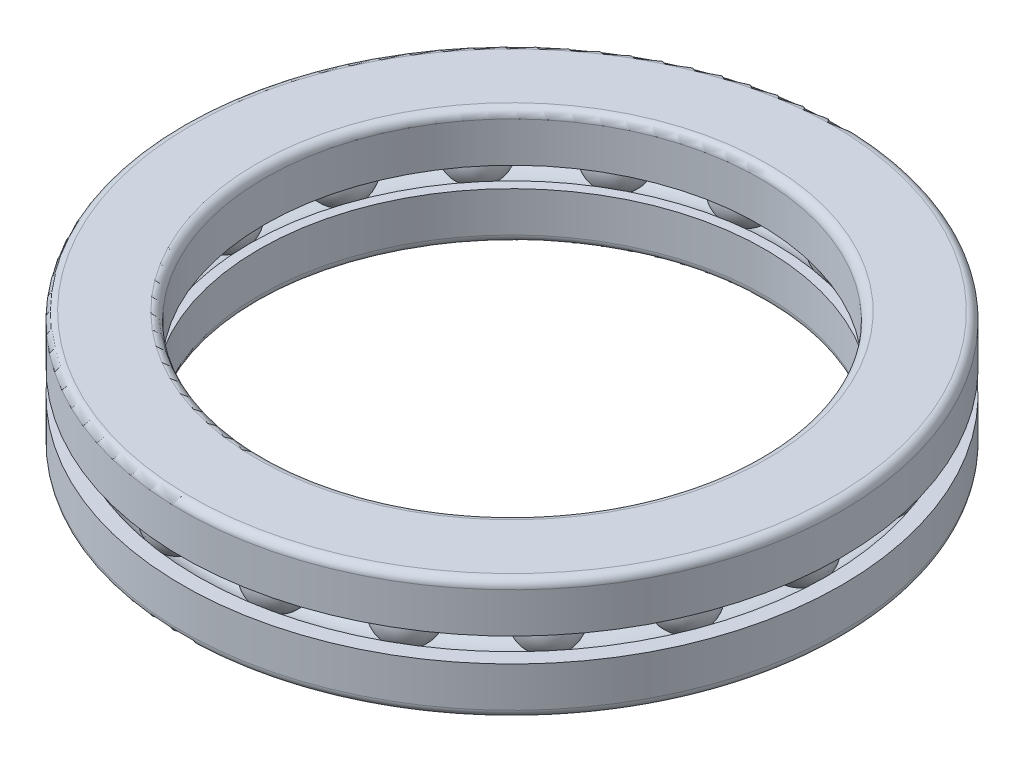
ISO-10303-21;
HEADER;
FILE_DESCRIPTION(('STEP AP214'),'2;1');
FILE_NAME('part.step','',(''),(''),'','','');
FILE_SCHEMA(('AUTOMOTIVE_DESIGN { 1 0 10303 214 1 1 1 1 }'));
ENDSEC;
DATA;
#1=APPLICATION_CONTEXT('core data for automotive mechanical design processes');
#2=APPLICATION_PROTOCOL_DEFINITION('international standard','automotive_design',2000,#1);
#3=PRODUCT_CONTEXT('',#1,'mechanical');
#4=PRODUCT('Part','Part','',(#3));
#5=PRODUCT_RELATED_PRODUCT_CATEGORY('part','',(#4));
#6=PRODUCT_DEFINITION_FORMATION('','',#4);
#7=PRODUCT_DEFINITION_CONTEXT('part definition',#1,'design');
#8=PRODUCT_DEFINITION('design','',#6,#7);
#9=PRODUCT_DEFINITION_SHAPE('','',#8);
#10=(LENGTH_UNIT() NAMED_UNIT(*) SI_UNIT(.MILLI.,.METRE.));
#11=(NAMED_UNIT(*) PLANE_ANGLE_UNIT() SI_UNIT($,.RADIAN.));
#12=(NAMED_UNIT(*) SI_UNIT($,.STERADIAN.) SOLID_ANGLE_UNIT());
#13=UNCERTAINTY_MEASURE_WITH_UNIT(LENGTH_MEASURE(1.E-05),#10,'distance_accuracy_value','');
#14=(GEOMETRIC_REPRESENTATION_CONTEXT(3) GLOBAL_UNCERTAINTY_ASSIGNED_CONTEXT((#13)) GLOBAL_UNIT_ASSIGNED_CONTEXT((#10,
#11,#12)) REPRESENTATION_CONTEXT('',''));
#15=CARTESIAN_POINT('',(0.,0.,0.));
#16=DIRECTION('',(0.,0.,1.));
#17=DIRECTION('',(1.,0.,0.));
#18=AXIS2_PLACEMENT_3D('',#15,#16,#17);
#19=CARTESIAN_POINT('',(49.3338625912603,11.,-17.9560575245973));
#20=DIRECTION('',(0.,-1.,0.));
#21=DIRECTION('',(0.93969262078591,0.,-0.342020143325663));
#22=AXIS2_PLACEMENT_3D('',#19,#20,#21);
#23=SPHERICAL_SURFACE('',#22,5.23809523809524);
#24=CARTESIAN_POINT('',(49.3338625912603,5.7619047619048,-17.9560575245973));
#25=VERTEX_POINT('',#24);
#26=VERTEX_LOOP('',#25);
#27=FACE_BOUND('',#26,.T.);
#28=ADVANCED_FACE('P0_F12',(#27),#23,.T.);
#29=CLOSED_SHELL('',(#28));
#30=MANIFOLD_SOLID_BREP('P0_B1',#29);
#31=CARTESIAN_POINT('',(-40.2173332637465,11.,33.7463495085431));
#32=DIRECTION('',(0.,-1.,0.));
#33=DIRECTION('',(-0.766044443118982,0.,0.642787609686535));
#34=AXIS2_PLACEMENT_3D('',#31,#32,#33);
#35=SPHERICAL_SURFACE('',#34,5.23809523809524);
#36=CARTESIAN_POINT('',(-40.2173332637465,5.7619047619048,33.7463495085431));
#37=VERTEX_POINT('',#36);
#38=VERTEX_LOOP('',#37);
#39=FACE_BOUND('',#38,.T.);
#40=ADVANCED_FACE('P1_F12',(#39),#35,.T.);
#41=CLOSED_SHELL('',(#40));
#42=MANIFOLD_SOLID_BREP('P1_B1',#41);
#43=CARTESIAN_POINT('',(52.5,11.,0.));
#44=DIRECTION('',(0.,-1.,0.));
#45=DIRECTION('',(1.,0.,0.));
#46=AXIS2_PLACEMENT_3D('',#43,#44,#45);
#47=SPHERICAL_SURFACE('',#46,5.23809523809524);
#48=CARTESIAN_POINT('',(52.5,5.76190476190476,0.));
#49=VERTEX_POINT('',#48);
#50=VERTEX_LOOP('',#49);
#51=FACE_BOUND('',#50,.T.);
#52=ADVANCED_FACE('P2_F12',(#51),#47,.T.);
#53=CLOSED_SHELL('',(#52));
#54=MANIFOLD_SOLID_BREP('P2_B1',#53);
#55=CARTESIAN_POINT('',(-26.2499999999997,11.,-45.4663336986832));
#56=DIRECTION('',(0.,-1.,0.));
#57=DIRECTION('',(-0.499999999999995,0.,-0.866025403784441));
#58=AXIS2_PLACEMENT_3D('',#55,#56,#57);
#59=SPHERICAL_SURFACE('',#58,5.23809523809524);
#60=CARTESIAN_POINT('',(-26.2499999999998,5.7619047619048,-45.4663336986832));
#61=VERTEX_POINT('',#60);
#62=VERTEX_LOOP('',#61);
#63=FACE_BOUND('',#62,.T.);
#64=ADVANCED_FACE('P3_F12',(#63),#59,.T.);
#65=CLOSED_SHELL('',(#64));
#66=MANIFOLD_SOLID_BREP('P3_B1',#65);
#67=CARTESIAN_POINT('',(9.11652932751351,11.,51.702407033141));
#68=DIRECTION('',(0.,-1.,0.));
#69=DIRECTION('',(0.173648177666924,0.,0.984807753012209));
#70=AXIS2_PLACEMENT_3D('',#67,#68,#69);
#71=SPHERICAL_SURFACE('',#70,5.23809523809524);
#72=CARTESIAN_POINT('',(9.11652932751351,5.7619047619048,51.702407033141));
#73=VERTEX_POINT('',#72);
#74=VERTEX_LOOP('',#73);
#75=FACE_BOUND('',#74,.T.);
#76=ADVANCED_FACE('P4_F12',(#75),#71,.T.);
#77=CLOSED_SHELL('',(#76));
#78=MANIFOLD_SOLID_BREP('P4_B1',#77);
#79=CARTESIAN_POINT('',(-26.2500000000003,11.,45.4663336986829));
#80=DIRECTION('',(0.,-1.,0.));
#81=DIRECTION('',(-0.500000000000005,0.,0.866025403784436));
#82=AXIS2_PLACEMENT_3D('',#79,#80,#81);
#83=SPHERICAL_SURFACE('',#82,5.23809523809524);
#84=CARTESIAN_POINT('',(-26.2500000000003,5.7619047619048,45.4663336986829));
#85=VERTEX_POINT('',#84);
#86=VERTEX_LOOP('',#85);
#87=FACE_BOUND('',#86,.T.);
#88=ADVANCED_FACE('P5_F12',(#87),#83,.T.);
#89=CLOSED_SHELL('',(#88));
#90=MANIFOLD_SOLID_BREP('P5_B1',#89);
#91=CARTESIAN_POINT('',(-9.11652932751414,11.,51.7024070331409));
#92=DIRECTION('',(0.,-1.,0.));
#93=DIRECTION('',(-0.173648177666936,0.,0.984807753012207));
#94=AXIS2_PLACEMENT_3D('',#91,#92,#93);
#95=SPHERICAL_SURFACE('',#94,5.23809523809524);
#96=CARTESIAN_POINT('',(-9.11652932751414,5.7619047619048,51.7024070331409));
#97=VERTEX_POINT('',#96);
#98=VERTEX_LOOP('',#97);
#99=FACE_BOUND('',#98,.T.);
#100=ADVANCED_FACE('P6_F12',(#99),#95,.T.);
#101=CLOSED_SHELL('',(#100));
#102=MANIFOLD_SOLID_BREP('P6_B1',#101);
#103=CARTESIAN_POINT('',(-49.3338625912603,11.,17.9560575245973));
#104=DIRECTION('',(0.,-1.,0.));
#105=DIRECTION('',(-0.93969262078591,0.,0.342020143325663));
#106=AXIS2_PLACEMENT_3D('',#103,#104,#105);
#107=SPHERICAL_SURFACE('',#106,5.23809523809524);
#108=CARTESIAN_POINT('',(-49.3338625912603,5.7619047619048,17.9560575245973));
#109=VERTEX_POINT('',#108);
#110=VERTEX_LOOP('',#109);
#111=FACE_BOUND('',#110,.T.);
#112=ADVANCED_FACE('P7_F12',(#111),#107,.T.);
#113=CLOSED_SHELL('',(#112));
#114=MANIFOLD_SOLID_BREP('P7_B1',#113);
#115=CARTESIAN_POINT('',(-52.5,11.,-3.03396197054439E-13));
#116=DIRECTION('',(0.,-1.,0.));
#117=DIRECTION('',(-1.,0.,0.));
#118=AXIS2_PLACEMENT_3D('',#115,#116,#117);
#119=SPHERICAL_SURFACE('',#118,5.23809523809524);
#120=CARTESIAN_POINT('',(-52.5,5.7619047619048,-3.03250810705977E-13));
#121=VERTEX_POINT('',#120);
#122=VERTEX_LOOP('',#121);
#123=FACE_BOUND('',#122,.T.);
#124=ADVANCED_FACE('P8_F12',(#123),#119,.T.);
#125=CLOSED_SHELL('',(#124));
#126=MANIFOLD_SOLID_BREP('P8_B1',#125);
#127=CARTESIAN_POINT('',(-9.11652932751356,11.,-51.702407033141));
#128=DIRECTION('',(0.,-1.,0.));
#129=DIRECTION('',(-0.173648177666925,0.,-0.984807753012209));
#130=AXIS2_PLACEMENT_3D('',#127,#128,#129);
#131=SPHERICAL_SURFACE('',#130,5.23809523809524);
#132=CARTESIAN_POINT('',(-9.11652932751356,5.7619047619048,-51.702407033141));
#133=VERTEX_POINT('',#132);
#134=VERTEX_LOOP('',#133);
#135=FACE_BOUND('',#134,.T.);
#136=ADVANCED_FACE('P9_F12',(#135),#131,.T.);
#137=CLOSED_SHELL('',(#136));
#138=MANIFOLD_SOLID_BREP('P9_B1',#137);
#139=CARTESIAN_POINT('',(0.,8.8,0.));
#140=DIRECTION('',(0.,1.,0.));
#141=DIRECTION('',(-1.,0.,0.));
#142=AXIS2_PLACEMENT_3D('',#139,#140,#141);
#143=PLANE('',#142);
#144=CARTESIAN_POINT('',(0.,8.8,0.));
#145=DIRECTION('',(0.,1.,0.));
#146=DIRECTION('',(-1.,0.,0.));
#147=AXIS2_PLACEMENT_3D('',#144,#145,#146);
#148=CIRCLE('',#147,47.7463023104791);
#149=CARTESIAN_POINT('',(-47.7463023104791,8.8,0.));
#150=VERTEX_POINT('',#149);
#151=EDGE_CURVE('P10_E11',#150,#150,#148,.T.);
#152=ORIENTED_EDGE('',*,*,#151,.T.);
#153=EDGE_LOOP('',(#152));
#154=FACE_BOUND('',#153,.T.);
#155=CARTESIAN_POINT('',(0.,8.8,0.));
#156=DIRECTION('',(0.,1.,0.));
#157=DIRECTION('',(-1.,0.,0.));
#158=AXIS2_PLACEMENT_3D('',#155,#156,#157);
#159=CIRCLE('',#158,46.);
#160=CARTESIAN_POINT('',(-46.,8.8,0.));
#161=VERTEX_POINT('',#160);
#162=EDGE_CURVE('P10_E66',#161,#161,#159,.T.);
#163=ORIENTED_EDGE('',*,*,#162,.F.);
#164=EDGE_LOOP('',(#163));
#165=FACE_BOUND('',#164,.T.);
#166=ADVANCED_FACE('P10_F16',(#154,#165),#143,.T.);
#167=CARTESIAN_POINT('',(0.,8.8,0.));
#168=DIRECTION('',(0.,1.,0.));
#169=DIRECTION('',(-1.,0.,0.));
#170=AXIS2_PLACEMENT_3D('',#167,#168,#169);
#171=PLANE('',#170);
#172=CARTESIAN_POINT('',(0.,8.8,0.));
#173=DIRECTION('',(0.,1.,0.));
#174=DIRECTION('',(-1.,0.,0.));
#175=AXIS2_PLACEMENT_3D('',#172,#173,#174);
#176=CIRCLE('',#175,60.);
#177=CARTESIAN_POINT('',(-60.,8.8,0.));
#178=VERTEX_POINT('',#177);
#179=EDGE_CURVE('P10_E23',#178,#178,#176,.T.);
#180=ORIENTED_EDGE('',*,*,#179,.T.);
#181=EDGE_LOOP('',(#180));
#182=FACE_BOUND('',#181,.T.);
#183=CARTESIAN_POINT('',(0.,8.8,0.));
#184=DIRECTION('',(0.,1.,0.));
#185=DIRECTION('',(-1.,0.,0.));
#186=AXIS2_PLACEMENT_3D('',#183,#184,#185);
#187=CIRCLE('',#186,57.2536976895209);
#188=CARTESIAN_POINT('',(-57.2536976895209,8.8,0.));
#189=VERTEX_POINT('',#188);
#190=EDGE_CURVE('P10_E63',#189,#189,#187,.T.);
#191=ORIENTED_EDGE('',*,*,#190,.F.);
#192=EDGE_LOOP('',(#191));
#193=FACE_BOUND('',#192,.T.);
#194=ADVANCED_FACE('P10_F73',(#182,#193),#171,.T.);
#195=CARTESIAN_POINT('',(0.,11.,0.));
#196=DIRECTION('',(0.,1.,0.));
#197=DIRECTION('',(-1.,0.,0.));
#198=AXIS2_PLACEMENT_3D('',#195,#196,#197);
#199=TOROIDAL_SURFACE('',#198,52.5,5.23809523809524);
#200=ORIENTED_EDGE('',*,*,#151,.F.);
#201=EDGE_LOOP('',(#200));
#202=FACE_BOUND('',#201,.T.);
#203=ORIENTED_EDGE('',*,*,#190,.T.);
#204=EDGE_LOOP('',(#203));
#205=FACE_BOUND('',#204,.T.);
#206=ADVANCED_FACE('P10_F79',(#202,#205),#199,.F.);
#207=CARTESIAN_POINT('',(0.,8.8,0.));
#208=DIRECTION('',(0.,1.,0.));
#209=DIRECTION('',(-1.,0.,0.));
#210=AXIS2_PLACEMENT_3D('',#207,#208,#209);
#211=CYLINDRICAL_SURFACE('',#210,46.);
#212=ORIENTED_EDGE('',*,*,#162,.T.);
#213=EDGE_LOOP('',(#212));
#214=FACE_BOUND('',#213,.T.);
#215=CARTESIAN_POINT('',(0.,1.5,0.));
#216=DIRECTION('',(0.,1.,0.));
#217=DIRECTION('',(-1.,0.,0.));
#218=AXIS2_PLACEMENT_3D('',#215,#216,#217);
#219=CIRCLE('',#218,46.);
#220=CARTESIAN_POINT('',(-46.,1.5,0.));
#221=VERTEX_POINT('',#220);
#222=EDGE_CURVE('P10_E60',#221,#221,#219,.T.);
#223=ORIENTED_EDGE('',*,*,#222,.F.);
#224=EDGE_LOOP('',(#223));
#225=FACE_BOUND('',#224,.T.);
#226=ADVANCED_FACE('P10_F69',(#214,#225),#211,.F.);
#227=CARTESIAN_POINT('',(0.,0.,0.));
#228=DIRECTION('',(0.,1.,0.));
#229=DIRECTION('',(-1.,0.,0.));
#230=AXIS2_PLACEMENT_3D('',#227,#228,#229);
#231=CYLINDRICAL_SURFACE('',#230,60.);
#232=ORIENTED_EDGE('',*,*,#179,.F.);
#233=EDGE_LOOP('',(#232));
#234=FACE_BOUND('',#233,.T.);
#235=CARTESIAN_POINT('',(0.,1.5,0.));
#236=DIRECTION('',(0.,1.,0.));
#237=DIRECTION('',(-1.,0.,0.));
#238=AXIS2_PLACEMENT_3D('',#235,#236,#237);
#239=CIRCLE('',#238,60.);
#240=CARTESIAN_POINT('',(-60.,1.5,0.));
#241=VERTEX_POINT('',#240);
#242=EDGE_CURVE('P10_E53',#241,#241,#239,.T.);
#243=ORIENTED_EDGE('',*,*,#242,.T.);
#244=EDGE_LOOP('',(#243));
#245=FACE_BOUND('',#244,.T.);
#246=ADVANCED_FACE('P10_F88',(#234,#245),#231,.T.);
#247=CARTESIAN_POINT('',(0.,0.,0.));
#248=DIRECTION('',(0.,-1.,0.));
#249=DIRECTION('',(-1.,0.,0.));
#250=AXIS2_PLACEMENT_3D('',#247,#248,#249);
#251=PLANE('',#250);
#252=CARTESIAN_POINT('',(0.,0.,0.));
#253=DIRECTION('',(0.,1.,0.));
#254=DIRECTION('',(-1.,0.,0.));
#255=AXIS2_PLACEMENT_3D('',#252,#253,#254);
#256=CIRCLE('',#255,58.5);
#257=CARTESIAN_POINT('',(-58.5,0.,0.));
#258=VERTEX_POINT('',#257);
#259=EDGE_CURVE('P10_E55',#258,#258,#256,.T.);
#260=ORIENTED_EDGE('',*,*,#259,.F.);
#261=EDGE_LOOP('',(#260));
#262=FACE_BOUND('',#261,.T.);
#263=CARTESIAN_POINT('',(0.,0.,0.));
#264=DIRECTION('',(0.,1.,0.));
#265=DIRECTION('',(-1.,0.,0.));
#266=AXIS2_PLACEMENT_3D('',#263,#264,#265);
#267=CIRCLE('',#266,47.5);
#268=CARTESIAN_POINT('',(-47.5,0.,0.));
#269=VERTEX_POINT('',#268);
#270=EDGE_CURVE('P10_E50',#269,#269,#267,.T.);
#271=ORIENTED_EDGE('',*,*,#270,.T.);
#272=EDGE_LOOP('',(#271));
#273=FACE_BOUND('',#272,.T.);
#274=ADVANCED_FACE('P10_F51',(#262,#273),#251,.T.);
#275=CARTESIAN_POINT('',(0.,1.5,0.));
#276=DIRECTION('',(0.,1.,0.));
#277=DIRECTION('',(-1.,0.,0.));
#278=AXIS2_PLACEMENT_3D('',#275,#276,#277);
#279=TOROIDAL_SURFACE('',#278,47.5,1.5);
#280=ORIENTED_EDGE('',*,*,#222,.T.);
#281=EDGE_LOOP('',(#280));
#282=FACE_BOUND('',#281,.T.);
#283=ORIENTED_EDGE('',*,*,#270,.F.);
#284=EDGE_LOOP('',(#283));
#285=FACE_BOUND('',#284,.T.);
#286=ADVANCED_FACE('P10_F96',(#282,#285),#279,.T.);
#287=CARTESIAN_POINT('',(0.,1.5,0.));
#288=DIRECTION('',(0.,1.,0.));
#289=DIRECTION('',(-1.,0.,0.));
#290=AXIS2_PLACEMENT_3D('',#287,#288,#289);
#291=TOROIDAL_SURFACE('',#290,58.5,1.5);
#292=ORIENTED_EDGE('',*,*,#259,.T.);
#293=EDGE_LOOP('',(#292));
#294=FACE_BOUND('',#293,.T.);
#295=ORIENTED_EDGE('',*,*,#242,.F.);
#296=EDGE_LOOP('',(#295));
#297=FACE_BOUND('',#296,.T.);
#298=ADVANCED_FACE('P10_F100',(#294,#297),#291,.T.);
#299=CLOSED_SHELL('',(#166,#194,#206,#226,#246,#274,#286,#298));
#300=MANIFOLD_SOLID_BREP('P10_B1',#299);
#301=CARTESIAN_POINT('',(40.2173332637465,11.,-33.7463495085431));
#302=DIRECTION('',(0.,-1.,0.));
#303=DIRECTION('',(0.766044443118982,0.,-0.642787609686535));
#304=AXIS2_PLACEMENT_3D('',#301,#302,#303);
#305=SPHERICAL_SURFACE('',#304,5.23809523809524);
#306=CARTESIAN_POINT('',(40.2173332637465,5.7619047619048,-33.7463495085431));
#307=VERTEX_POINT('',#306);
#308=VERTEX_LOOP('',#307);
#309=FACE_BOUND('',#308,.T.);
#310=ADVANCED_FACE('P11_F12',(#309),#305,.T.);
#311=CLOSED_SHELL('',(#310));
#312=MANIFOLD_SOLID_BREP('P11_B1',#311);
#313=CARTESIAN_POINT('',(-49.3338625912601,11.,-17.9560575245979));
#314=DIRECTION('',(0.,-1.,0.));
#315=DIRECTION('',(-0.939692620785906,0.,-0.342020143325674));
#316=AXIS2_PLACEMENT_3D('',#313,#314,#315);
#317=SPHERICAL_SURFACE('',#316,5.23809523809524);
#318=CARTESIAN_POINT('',(-49.3338625912601,5.7619047619048,-17.9560575245979));
#319=VERTEX_POINT('',#318);
#320=VERTEX_LOOP('',#319);
#321=FACE_BOUND('',#320,.T.);
#322=ADVANCED_FACE('P12_F12',(#321),#317,.T.);
#323=CLOSED_SHELL('',(#322));
#324=MANIFOLD_SOLID_BREP('P12_B1',#323);
#325=CARTESIAN_POINT('',(26.2499999999997,11.,45.4663336986832));
#326=DIRECTION('',(0.,-1.,0.));
#327=DIRECTION('',(0.499999999999995,0.,0.866025403784442));
#328=AXIS2_PLACEMENT_3D('',#325,#326,#327);
#329=SPHERICAL_SURFACE('',#328,5.23809523809524);
#330=CARTESIAN_POINT('',(26.2499999999997,5.7619047619048,45.4663336986832));
#331=VERTEX_POINT('',#330);
#332=VERTEX_LOOP('',#331);
#333=FACE_BOUND('',#332,.T.);
#334=ADVANCED_FACE('P13_F12',(#333),#329,.T.);
#335=CLOSED_SHELL('',(#334));
#336=MANIFOLD_SOLID_BREP('P13_B1',#335);
#337=CARTESIAN_POINT('',(-40.2173332637461,11.,-33.7463495085436));
#338=DIRECTION('',(0.,-1.,0.));
#339=DIRECTION('',(-0.766044443118974,0.,-0.642787609686544));
#340=AXIS2_PLACEMENT_3D('',#337,#338,#339);
#341=SPHERICAL_SURFACE('',#340,5.23809523809524);
#342=CARTESIAN_POINT('',(-40.2173332637461,5.7619047619048,-33.7463495085436));
#343=VERTEX_POINT('',#342);
#344=VERTEX_LOOP('',#343);
#345=FACE_BOUND('',#344,.T.);
#346=ADVANCED_FACE('P14_F12',(#345),#341,.T.);
#347=CLOSED_SHELL('',(#346));
#348=MANIFOLD_SOLID_BREP('P14_B1',#347);
#349=CARTESIAN_POINT('',(49.3338625912601,11.,17.9560575245979));
#350=DIRECTION('',(0.,-1.,0.));
#351=DIRECTION('',(0.939692620785906,0.,0.342020143325674));
#352=AXIS2_PLACEMENT_3D('',#349,#350,#351);
#353=SPHERICAL_SURFACE('',#352,5.23809523809524);
#354=CARTESIAN_POINT('',(49.3338625912601,5.7619047619048,17.9560575245979));
#355=VERTEX_POINT('',#354);
#356=VERTEX_LOOP('',#355);
#357=FACE_BOUND('',#356,.T.);
#358=ADVANCED_FACE('P15_F12',(#357),#353,.T.);
#359=CLOSED_SHELL('',(#358));
#360=MANIFOLD_SOLID_BREP('P15_B1',#359);
#361=CARTESIAN_POINT('',(0.,13.2,0.));
#362=DIRECTION('',(0.,-1.,0.));
#363=DIRECTION('',(-1.,0.,0.));
#364=AXIS2_PLACEMENT_3D('',#361,#362,#363);
#365=PLANE('',#364);
#366=CARTESIAN_POINT('',(0.,13.2,0.));
#367=DIRECTION('',(0.,-1.,0.));
#368=DIRECTION('',(-1.,0.,0.));
#369=AXIS2_PLACEMENT_3D('',#366,#367,#368);
#370=CIRCLE('',#369,47.7463023104791);
#371=CARTESIAN_POINT('',(-47.7463023104791,13.2000000000001,1.18887746733202E-13));
#372=VERTEX_POINT('',#371);
#373=EDGE_CURVE('P16_E11',#372,#372,#370,.T.);
#374=ORIENTED_EDGE('',*,*,#373,.T.);
#375=EDGE_LOOP('',(#374));
#376=FACE_BOUND('',#375,.T.);
#377=CARTESIAN_POINT('',(0.,13.2,0.));
#378=DIRECTION('',(0.,-1.,0.));
#379=DIRECTION('',(-1.,0.,0.));
#380=AXIS2_PLACEMENT_3D('',#377,#378,#379);
#381=CIRCLE('',#380,45.);
#382=CARTESIAN_POINT('',(-45.,13.2000000000001,1.06561368981077E-13));
#383=VERTEX_POINT('',#382);
#384=EDGE_CURVE('P16_E66',#383,#383,#381,.T.);
#385=ORIENTED_EDGE('',*,*,#384,.F.);
#386=EDGE_LOOP('',(#385));
#387=FACE_BOUND('',#386,.T.);
#388=ADVANCED_FACE('P16_F16',(#376,#387),#365,.T.);
#389=CARTESIAN_POINT('',(0.,13.2,0.));
#390=DIRECTION('',(0.,-1.,0.));
#391=DIRECTION('',(-1.,0.,0.));
#392=AXIS2_PLACEMENT_3D('',#389,#390,#391);
#393=PLANE('',#392);
#394=CARTESIAN_POINT('',(0.,13.2,0.));
#395=DIRECTION('',(0.,-1.,0.));
#396=DIRECTION('',(-1.,0.,0.));
#397=AXIS2_PLACEMENT_3D('',#394,#395,#396);
#398=CIRCLE('',#397,60.);
#399=CARTESIAN_POINT('',(-60.,13.2000000000001,1.41949727891004E-13));
#400=VERTEX_POINT('',#399);
#401=EDGE_CURVE('P16_E23',#400,#400,#398,.T.);
#402=ORIENTED_EDGE('',*,*,#401,.T.);
#403=EDGE_LOOP('',(#402));
#404=FACE_BOUND('',#403,.T.);
#405=CARTESIAN_POINT('',(0.,13.2,0.));
#406=DIRECTION('',(0.,-1.,0.));
#407=DIRECTION('',(-1.,0.,0.));
#408=AXIS2_PLACEMENT_3D('',#405,#406,#407);
#409=CIRCLE('',#408,57.2536976895209);
#410=CARTESIAN_POINT('',(-57.2536976895209,13.2000000000001,1.42482141529926E-13));
#411=VERTEX_POINT('',#410);
#412=EDGE_CURVE('P16_E63',#411,#411,#409,.T.);
#413=ORIENTED_EDGE('',*,*,#412,.F.);
#414=EDGE_LOOP('',(#413));
#415=FACE_BOUND('',#414,.T.);
#416=ADVANCED_FACE('P16_F73',(#404,#415),#393,.T.);
#417=CARTESIAN_POINT('',(0.,11.,0.));
#418=DIRECTION('',(0.,-1.,0.));
#419=DIRECTION('',(-1.,0.,0.));
#420=AXIS2_PLACEMENT_3D('',#417,#418,#419);
#421=TOROIDAL_SURFACE('',#420,52.5,5.23809523809524);
#422=ORIENTED_EDGE('',*,*,#373,.F.);
#423=EDGE_LOOP('',(#422));
#424=FACE_BOUND('',#423,.T.);
#425=ORIENTED_EDGE('',*,*,#412,.T.);
#426=EDGE_LOOP('',(#425));
#427=FACE_BOUND('',#426,.T.);
#428=ADVANCED_FACE('P16_F78',(#424,#427),#421,.F.);
#429=CARTESIAN_POINT('',(0.,13.2,0.));
#430=DIRECTION('',(0.,-1.,0.));
#431=DIRECTION('',(-1.,0.,0.));
#432=AXIS2_PLACEMENT_3D('',#429,#430,#431);
#433=CYLINDRICAL_SURFACE('',#432,45.);
#434=ORIENTED_EDGE('',*,*,#384,.T.);
#435=EDGE_LOOP('',(#434));
#436=FACE_BOUND('',#435,.T.);
#437=CARTESIAN_POINT('',(0.,20.5,0.));
#438=DIRECTION('',(0.,-1.,0.));
#439=DIRECTION('',(-1.,0.,0.));
#440=AXIS2_PLACEMENT_3D('',#437,#438,#439);
#441=CIRCLE('',#440,45.);
#442=CARTESIAN_POINT('',(-45.,20.5000000000001,1.12291441201063E-13));
#443=VERTEX_POINT('',#442);
#444=EDGE_CURVE('P16_E60',#443,#443,#441,.T.);
#445=ORIENTED_EDGE('',*,*,#444,.F.);
#446=EDGE_LOOP('',(#445));
#447=FACE_BOUND('',#446,.T.);
#448=ADVANCED_FACE('P16_F69',(#436,#447),#433,.F.);
#449=CARTESIAN_POINT('',(0.,22.,0.));
#450=DIRECTION('',(0.,-1.,0.));
#451=DIRECTION('',(-1.,0.,0.));
#452=AXIS2_PLACEMENT_3D('',#449,#450,#451);
#453=CYLINDRICAL_SURFACE('',#452,60.);
#454=ORIENTED_EDGE('',*,*,#401,.F.);
#455=EDGE_LOOP('',(#454));
#456=FACE_BOUND('',#455,.T.);
#457=CARTESIAN_POINT('',(0.,20.5,0.));
#458=DIRECTION('',(0.,-1.,0.));
#459=DIRECTION('',(-1.,0.,0.));
#460=AXIS2_PLACEMENT_3D('',#457,#458,#459);
#461=CIRCLE('',#460,60.);
#462=CARTESIAN_POINT('',(-60.,20.5000000000001,1.49516770309711E-13));
#463=VERTEX_POINT('',#462);
#464=EDGE_CURVE('P16_E53',#463,#463,#461,.T.);
#465=ORIENTED_EDGE('',*,*,#464,.T.);
#466=EDGE_LOOP('',(#465));
#467=FACE_BOUND('',#466,.T.);
#468=ADVANCED_FACE('P16_F86',(#456,#467),#453,.T.);
#469=CARTESIAN_POINT('',(0.,22.,0.));
#470=DIRECTION('',(0.,1.,0.));
#471=DIRECTION('',(-1.,0.,0.));
#472=AXIS2_PLACEMENT_3D('',#469,#470,#471);
#473=PLANE('',#472);
#474=CARTESIAN_POINT('',(0.,22.,0.));
#475=DIRECTION('',(0.,-1.,0.));
#476=DIRECTION('',(-1.,0.,0.));
#477=AXIS2_PLACEMENT_3D('',#474,#475,#476);
#478=CIRCLE('',#477,58.5);
#479=CARTESIAN_POINT('',(-58.5,22.0000000000001,1.45839270609221E-13));
#480=VERTEX_POINT('',#479);
#481=EDGE_CURVE('P16_E55',#480,#480,#478,.T.);
#482=ORIENTED_EDGE('',*,*,#481,.F.);
#483=EDGE_LOOP('',(#482));
#484=FACE_BOUND('',#483,.T.);
#485=CARTESIAN_POINT('',(0.,22.,0.));
#486=DIRECTION('',(0.,-1.,0.));
#487=DIRECTION('',(-1.,0.,0.));
#488=AXIS2_PLACEMENT_3D('',#485,#486,#487);
#489=CIRCLE('',#488,46.5);
#490=CARTESIAN_POINT('',(-46.5,22.0000000000001,1.16059007322302E-13));
#491=VERTEX_POINT('',#490);
#492=EDGE_CURVE('P16_E50',#491,#491,#489,.T.);
#493=ORIENTED_EDGE('',*,*,#492,.T.);
#494=EDGE_LOOP('',(#493));
#495=FACE_BOUND('',#494,.T.);
#496=ADVANCED_FACE('P16_F51',(#484,#495),#473,.T.);
#497=CARTESIAN_POINT('',(0.,20.5,0.));
#498=DIRECTION('',(0.,-1.,0.));
#499=DIRECTION('',(-1.,0.,0.));
#500=AXIS2_PLACEMENT_3D('',#497,#498,#499);
#501=TOROIDAL_SURFACE('',#500,46.5,1.5);
#502=ORIENTED_EDGE('',*,*,#444,.T.);
#503=EDGE_LOOP('',(#502));
#504=FACE_BOUND('',#503,.T.);
#505=ORIENTED_EDGE('',*,*,#492,.F.);
#506=EDGE_LOOP('',(#505));
#507=FACE_BOUND('',#506,.T.);
#508=ADVANCED_FACE('P16_F94',(#504,#507),#501,.T.);
#509=CARTESIAN_POINT('',(0.,20.5,0.));
#510=DIRECTION('',(0.,-1.,0.));
#511=DIRECTION('',(-1.,0.,0.));
#512=AXIS2_PLACEMENT_3D('',#509,#510,#511);
#513=TOROIDAL_SURFACE('',#512,58.5,1.5);
#514=ORIENTED_EDGE('',*,*,#481,.T.);
#515=EDGE_LOOP('',(#514));
#516=FACE_BOUND('',#515,.T.);
#517=ORIENTED_EDGE('',*,*,#464,.F.);
#518=EDGE_LOOP('',(#517));
#519=FACE_BOUND('',#518,.T.);
#520=ADVANCED_FACE('P16_F98',(#516,#519),#513,.T.);
#521=CLOSED_SHELL('',(#388,#416,#428,#448,#468,#496,#508,#520));
#522=MANIFOLD_SOLID_BREP('P16_B1',#521);
#523=CARTESIAN_POINT('',(9.11652932751414,11.,-51.7024070331409));
#524=DIRECTION('',(0.,-1.,0.));
#525=DIRECTION('',(0.173648177666936,0.,-0.984807753012207));
#526=AXIS2_PLACEMENT_3D('',#523,#524,#525);
#527=SPHERICAL_SURFACE('',#526,5.23809523809524);
#528=CARTESIAN_POINT('',(9.11652932751414,5.7619047619048,-51.7024070331409));
#529=VERTEX_POINT('',#528);
#530=VERTEX_LOOP('',#529);
#531=FACE_BOUND('',#530,.T.);
#532=ADVANCED_FACE('P17_F12',(#531),#527,.T.);
#533=CLOSED_SHELL('',(#532));
#534=MANIFOLD_SOLID_BREP('P17_B1',#533);
#535=CARTESIAN_POINT('',(26.2500000000003,11.,-45.4663336986829));
#536=DIRECTION('',(0.,-1.,0.));
#537=DIRECTION('',(0.500000000000005,0.,-0.866025403784436));
#538=AXIS2_PLACEMENT_3D('',#535,#536,#537);
#539=SPHERICAL_SURFACE('',#538,5.23809523809524);
#540=CARTESIAN_POINT('',(26.2500000000003,5.7619047619048,-45.4663336986829));
#541=VERTEX_POINT('',#540);
#542=VERTEX_LOOP('',#541);
#543=FACE_BOUND('',#542,.T.);
#544=ADVANCED_FACE('P18_F12',(#543),#539,.T.);
#545=CLOSED_SHELL('',(#544));
#546=MANIFOLD_SOLID_BREP('P18_B1',#545);
#547=CARTESIAN_POINT('',(40.2173332637461,11.,33.7463495085436));
#548=DIRECTION('',(0.,-1.,0.));
#549=DIRECTION('',(0.766044443118974,0.,0.642787609686544));
#550=AXIS2_PLACEMENT_3D('',#547,#548,#549);
#551=SPHERICAL_SURFACE('',#550,5.23809523809524);
#552=CARTESIAN_POINT('',(40.2173332637461,5.7619047619048,33.7463495085436));
#553=VERTEX_POINT('',#552);
#554=VERTEX_LOOP('',#553);
#555=FACE_BOUND('',#554,.T.);
#556=ADVANCED_FACE('P19_F11',(#555),#551,.T.);
#557=CLOSED_SHELL('',(#556));
#558=MANIFOLD_SOLID_BREP('P19_B1',#557);
#559=ADVANCED_BREP_SHAPE_REPRESENTATION('',(#18,#30,#42,#54,#66,#78,#90,#102,#114,#126,#138,
#300,#312,#324,#336,#348,#360,#522,#534,#546,#558),#14);
#560=SHAPE_DEFINITION_REPRESENTATION(#9,#559);
ENDSEC;
END-ISO-10303-21;
